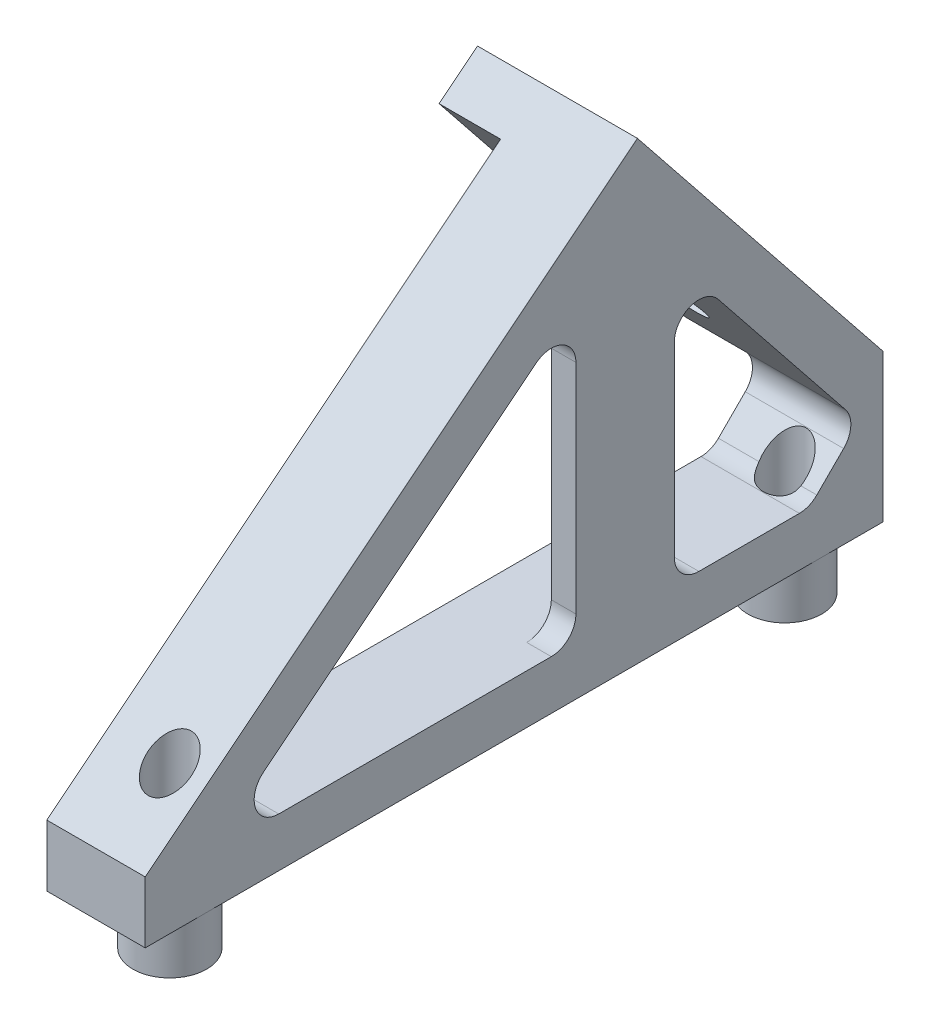
ISO-10303-21;
HEADER;
FILE_DESCRIPTION(('STEP AP214'),'2;1');
FILE_NAME('part.step','',(''),(''),'','','');
FILE_SCHEMA(('AUTOMOTIVE_DESIGN { 1 0 10303 214 1 1 1 1 }'));
ENDSEC;
DATA;
#1=APPLICATION_CONTEXT('core data for automotive mechanical design processes');
#2=APPLICATION_PROTOCOL_DEFINITION('international standard','automotive_design',2000,#1);
#3=PRODUCT_CONTEXT('',#1,'mechanical');
#4=PRODUCT('Part','Part','',(#3));
#5=PRODUCT_RELATED_PRODUCT_CATEGORY('part','',(#4));
#6=PRODUCT_DEFINITION_FORMATION('','',#4);
#7=PRODUCT_DEFINITION_CONTEXT('part definition',#1,'design');
#8=PRODUCT_DEFINITION('design','',#6,#7);
#9=PRODUCT_DEFINITION_SHAPE('','',#8);
#10=(LENGTH_UNIT() NAMED_UNIT(*) SI_UNIT(.MILLI.,.METRE.));
#11=(NAMED_UNIT(*) PLANE_ANGLE_UNIT() SI_UNIT($,.RADIAN.));
#12=(NAMED_UNIT(*) SI_UNIT($,.STERADIAN.) SOLID_ANGLE_UNIT());
#13=UNCERTAINTY_MEASURE_WITH_UNIT(LENGTH_MEASURE(1.E-05),#10,'distance_accuracy_value','');
#14=(GEOMETRIC_REPRESENTATION_CONTEXT(3) GLOBAL_UNCERTAINTY_ASSIGNED_CONTEXT((#13)) GLOBAL_UNIT_ASSIGNED_CONTEXT((#10,
#11,#12)) REPRESENTATION_CONTEXT('',''));
#15=CARTESIAN_POINT('',(0.,0.,0.));
#16=DIRECTION('',(0.,0.,1.));
#17=DIRECTION('',(1.,0.,0.));
#18=AXIS2_PLACEMENT_3D('',#15,#16,#17);
#19=CARTESIAN_POINT('',(13.,0.,0.));
#20=DIRECTION('',(0.,1.,0.));
#21=DIRECTION('',(0.,0.,1.));
#22=AXIS2_PLACEMENT_3D('',#19,#20,#21);
#23=PLANE('',#22);
#24=DIRECTION('',(0.,0.,-1.));
#25=VECTOR('',#24,1.);
#26=CARTESIAN_POINT('',(13.,0.,0.));
#27=LINE('',#26,#25);
#28=CARTESIAN_POINT('',(13.,0.,5.));
#29=VERTEX_POINT('',#28);
#30=CARTESIAN_POINT('',(13.,0.,0.));
#31=VERTEX_POINT('',#30);
#32=EDGE_CURVE('E333',#29,#31,#27,.T.);
#33=ORIENTED_EDGE('',*,*,#32,.F.);
#34=CARTESIAN_POINT('',(10.,0.,5.));
#35=DIRECTION('',(0.,-1.,0.));
#36=DIRECTION('',(0.,0.,-1.));
#37=AXIS2_PLACEMENT_3D('',#34,#35,#36);
#38=CIRCLE('',#37,3.);
#39=EDGE_CURVE('E520',#29,#29,#38,.T.);
#40=ORIENTED_EDGE('',*,*,#39,.F.);
#41=CARTESIAN_POINT('',(13.,0.,55.));
#42=VERTEX_POINT('',#41);
#43=EDGE_CURVE('E337',#42,#29,#27,.T.);
#44=ORIENTED_EDGE('',*,*,#43,.F.);
#45=CARTESIAN_POINT('',(10.,0.,55.));
#46=DIRECTION('',(0.,-1.,0.));
#47=DIRECTION('',(0.,0.,-1.));
#48=AXIS2_PLACEMENT_3D('',#45,#46,#47);
#49=CIRCLE('',#48,3.);
#50=EDGE_CURVE('E527',#42,#42,#49,.T.);
#51=ORIENTED_EDGE('',*,*,#50,.F.);
#52=CARTESIAN_POINT('',(13.,0.,60.));
#53=VERTEX_POINT('',#52);
#54=EDGE_CURVE('E334',#53,#42,#27,.T.);
#55=ORIENTED_EDGE('',*,*,#54,.F.);
#56=DIRECTION('',(-1.,0.,0.));
#57=VECTOR('',#56,1.);
#58=CARTESIAN_POINT('',(13.,0.,60.));
#59=LINE('',#58,#57);
#60=CARTESIAN_POINT('',(5.,0.,60.));
#61=VERTEX_POINT('',#60);
#62=EDGE_CURVE('E343',#53,#61,#59,.T.);
#63=ORIENTED_EDGE('',*,*,#62,.T.);
#64=DIRECTION('',(0.,0.,-1.));
#65=VECTOR('',#64,1.);
#66=CARTESIAN_POINT('',(5.,0.,0.));
#67=LINE('',#66,#65);
#68=CARTESIAN_POINT('',(5.,0.,0.));
#69=VERTEX_POINT('',#68);
#70=EDGE_CURVE('E358',#61,#69,#67,.T.);
#71=ORIENTED_EDGE('',*,*,#70,.T.);
#72=DIRECTION('',(-1.,0.,0.));
#73=VECTOR('',#72,1.);
#74=CARTESIAN_POINT('',(13.,0.,0.));
#75=LINE('',#74,#73);
#76=EDGE_CURVE('E336',#31,#69,#75,.T.);
#77=ORIENTED_EDGE('',*,*,#76,.F.);
#78=EDGE_LOOP('',(#33,#40,#44,#51,#55,#63,#71,#77));
#79=FACE_BOUND('',#78,.T.);
#80=ADVANCED_FACE('F32',(#79),#23,.F.);
#81=CARTESIAN_POINT('',(0.,27.8751456380356,24.9826212271511));
#82=DIRECTION('',(0.,0.,-1.));
#83=DIRECTION('',(0.,1.,0.));
#84=AXIS2_PLACEMENT_3D('',#81,#82,#83);
#85=PLANE('',#84);
#86=DIRECTION('',(0.,1.,0.));
#87=VECTOR('',#86,1.);
#88=CARTESIAN_POINT('',(11.,27.8751456380356,24.9826212271511));
#89=LINE('',#88,#87);
#90=CARTESIAN_POINT('',(11.,6.,24.9826212271511));
#91=VERTEX_POINT('',#90);
#92=CARTESIAN_POINT('',(11.,23.7155203644786,24.9826212271511));
#93=VERTEX_POINT('',#92);
#94=EDGE_CURVE('E397',#91,#93,#89,.T.);
#95=ORIENTED_EDGE('',*,*,#94,.F.);
#96=DIRECTION('',(1.,0.,0.));
#97=VECTOR('',#96,1.);
#98=CARTESIAN_POINT('',(13.,6.,24.9826212271511));
#99=LINE('',#98,#97);
#100=CARTESIAN_POINT('',(13.,6.,24.9826212271511));
#101=VERTEX_POINT('',#100);
#102=EDGE_CURVE('E236',#91,#101,#99,.T.);
#103=ORIENTED_EDGE('',*,*,#102,.T.);
#104=DIRECTION('',(0.,1.,0.));
#105=VECTOR('',#104,1.);
#106=CARTESIAN_POINT('',(13.,27.8751456380356,24.9826212271511));
#107=LINE('',#106,#105);
#108=CARTESIAN_POINT('',(13.,23.7155203644786,24.9826212271511));
#109=VERTEX_POINT('',#108);
#110=EDGE_CURVE('E307',#101,#109,#107,.T.);
#111=ORIENTED_EDGE('',*,*,#110,.T.);
#112=DIRECTION('',(1.,0.,0.));
#113=VECTOR('',#112,1.);
#114=CARTESIAN_POINT('',(5.,23.7155203644786,24.9826212271511));
#115=LINE('',#114,#113);
#116=EDGE_CURVE('E233',#109,#93,#115,.F.);
#117=ORIENTED_EDGE('',*,*,#116,.T.);
#118=EDGE_LOOP('',(#95,#103,#111,#117));
#119=FACE_BOUND('',#118,.T.);
#120=ADVANCED_FACE('F441',(#119),#85,.F.);
#121=CARTESIAN_POINT('',(0.,3.99999999999999,16.9826212271511));
#122=DIRECTION('',(0.,0.,1.));
#123=DIRECTION('',(1.,0.,0.));
#124=AXIS2_PLACEMENT_3D('',#121,#122,#123);
#125=PLANE('',#124);
#126=DIRECTION('',(0.,-1.,0.));
#127=VECTOR('',#126,1.);
#128=CARTESIAN_POINT('',(11.,3.99999999999999,16.9826212271511));
#129=LINE('',#128,#127);
#130=CARTESIAN_POINT('',(11.,21.131638846144,16.9826212271511));
#131=VERTEX_POINT('',#130);
#132=CARTESIAN_POINT('',(11.,5.99999999999999,16.9826212271511));
#133=VERTEX_POINT('',#132);
#134=EDGE_CURVE('E270',#131,#133,#129,.T.);
#135=ORIENTED_EDGE('',*,*,#134,.F.);
#136=DIRECTION('',(1.,0.,0.));
#137=VECTOR('',#136,1.);
#138=CARTESIAN_POINT('',(13.,21.131638846144,16.9826212271511));
#139=LINE('',#138,#137);
#140=CARTESIAN_POINT('',(13.,21.131638846144,16.9826212271511));
#141=VERTEX_POINT('',#140);
#142=EDGE_CURVE('E371',#131,#141,#139,.T.);
#143=ORIENTED_EDGE('',*,*,#142,.T.);
#144=DIRECTION('',(0.,-1.,0.));
#145=VECTOR('',#144,1.);
#146=CARTESIAN_POINT('',(13.,3.99999999999999,16.9826212271511));
#147=LINE('',#146,#145);
#148=CARTESIAN_POINT('',(13.,5.99999999999999,16.9826212271511));
#149=VERTEX_POINT('',#148);
#150=EDGE_CURVE('E287',#141,#149,#147,.T.);
#151=ORIENTED_EDGE('',*,*,#150,.T.);
#152=DIRECTION('',(1.,0.,0.));
#153=VECTOR('',#152,1.);
#154=CARTESIAN_POINT('',(5.,5.99999999999999,16.9826212271511));
#155=LINE('',#154,#153);
#156=EDGE_CURVE('E216',#149,#133,#155,.F.);
#157=ORIENTED_EDGE('',*,*,#156,.T.);
#158=EDGE_LOOP('',(#135,#143,#151,#157));
#159=FACE_BOUND('',#158,.T.);
#160=ADVANCED_FACE('F376',(#159),#125,.F.);
#161=CARTESIAN_POINT('',(0.,5.99999999999999,14.9826212271511));
#162=DIRECTION('',(-1.,0.,0.));
#163=DIRECTION('',(0.,0.,1.));
#164=AXIS2_PLACEMENT_3D('',#161,#162,#163);
#165=CYLINDRICAL_SURFACE('',#164,2.);
#166=CARTESIAN_POINT('',(11.,5.99999999999999,14.9826212271511));
#167=DIRECTION('',(-1.,0.,0.));
#168=DIRECTION('',(0.,0.,1.));
#169=AXIS2_PLACEMENT_3D('',#166,#167,#168);
#170=CIRCLE('',#169,2.);
#171=CARTESIAN_POINT('',(11.,3.99999999999999,14.9826212271511));
#172=VERTEX_POINT('',#171);
#173=EDGE_CURVE('E266',#133,#172,#170,.F.);
#174=ORIENTED_EDGE('',*,*,#173,.F.);
#175=ORIENTED_EDGE('',*,*,#156,.F.);
#176=CARTESIAN_POINT('',(13.,5.99999999999999,14.9826212271511));
#177=DIRECTION('',(-1.,0.,0.));
#178=DIRECTION('',(0.,0.,1.));
#179=AXIS2_PLACEMENT_3D('',#176,#177,#178);
#180=CIRCLE('',#179,2.);
#181=CARTESIAN_POINT('',(13.,3.99999999999999,14.9826212271511));
#182=VERTEX_POINT('',#181);
#183=EDGE_CURVE('E238',#182,#149,#180,.T.);
#184=ORIENTED_EDGE('',*,*,#183,.F.);
#185=DIRECTION('',(1.,0.,0.));
#186=VECTOR('',#185,1.);
#187=CARTESIAN_POINT('',(13.,3.99999999999999,14.9826212271511));
#188=LINE('',#187,#186);
#189=EDGE_CURVE('E369',#172,#182,#188,.T.);
#190=ORIENTED_EDGE('',*,*,#189,.F.);
#191=EDGE_LOOP('',(#174,#175,#184,#190));
#192=FACE_BOUND('',#191,.T.);
#193=ADVANCED_FACE('F382',(#192),#165,.F.);
#194=CARTESIAN_POINT('',(0.,21.131638846144,14.9826212271511));
#195=DIRECTION('',(-1.,0.,0.));
#196=DIRECTION('',(0.,0.,1.));
#197=AXIS2_PLACEMENT_3D('',#194,#195,#196);
#198=CYLINDRICAL_SURFACE('',#197,2.);
#199=CARTESIAN_POINT('',(11.,21.131638846144,14.9826212271511));
#200=DIRECTION('',(-1.,0.,0.));
#201=DIRECTION('',(0.,0.,1.));
#202=AXIS2_PLACEMENT_3D('',#199,#200,#201);
#203=CIRCLE('',#202,2.);
#204=CARTESIAN_POINT('',(11.,22.380552672841,13.4205027126058));
#205=VERTEX_POINT('',#204);
#206=EDGE_CURVE('E406',#205,#131,#203,.F.);
#207=ORIENTED_EDGE('',*,*,#206,.F.);
#208=DIRECTION('',(1.,0.,0.));
#209=VECTOR('',#208,1.);
#210=CARTESIAN_POINT('',(5.,22.380552672841,13.4205027126058));
#211=LINE('',#210,#209);
#212=CARTESIAN_POINT('',(13.,22.3805526728409,13.4205027126059));
#213=VERTEX_POINT('',#212);
#214=EDGE_CURVE('E215',#213,#205,#211,.F.);
#215=ORIENTED_EDGE('',*,*,#214,.F.);
#216=CARTESIAN_POINT('',(13.,21.131638846144,14.9826212271511));
#217=DIRECTION('',(-1.,0.,0.));
#218=DIRECTION('',(0.,0.,1.));
#219=AXIS2_PLACEMENT_3D('',#216,#217,#218);
#220=CIRCLE('',#219,2.);
#221=EDGE_CURVE('E247',#141,#213,#220,.T.);
#222=ORIENTED_EDGE('',*,*,#221,.F.);
#223=ORIENTED_EDGE('',*,*,#142,.F.);
#224=EDGE_LOOP('',(#207,#215,#222,#223));
#225=FACE_BOUND('',#224,.T.);
#226=ADVANCED_FACE('F411',(#225),#198,.F.);
#227=CARTESIAN_POINT('',(0.,5.99999999999999,26.9826212271511));
#228=DIRECTION('',(-1.,0.,0.));
#229=DIRECTION('',(0.,0.,1.));
#230=AXIS2_PLACEMENT_3D('',#227,#228,#229);
#231=CYLINDRICAL_SURFACE('',#230,2.);
#232=CARTESIAN_POINT('',(11.,5.99999999999999,26.9826212271511));
#233=DIRECTION('',(-1.,0.,0.));
#234=DIRECTION('',(0.,0.,1.));
#235=AXIS2_PLACEMENT_3D('',#232,#233,#234);
#236=CIRCLE('',#235,2.);
#237=CARTESIAN_POINT('',(11.,3.99999999999999,26.9826212271511));
#238=VERTEX_POINT('',#237);
#239=EDGE_CURVE('E404',#238,#91,#236,.F.);
#240=ORIENTED_EDGE('',*,*,#239,.F.);
#241=DIRECTION('',(1.,0.,0.));
#242=VECTOR('',#241,1.);
#243=CARTESIAN_POINT('',(5.,3.99999999999999,26.9826212271511));
#244=LINE('',#243,#242);
#245=CARTESIAN_POINT('',(13.,3.99999999999999,26.9826212271511));
#246=VERTEX_POINT('',#245);
#247=EDGE_CURVE('E224',#246,#238,#244,.F.);
#248=ORIENTED_EDGE('',*,*,#247,.F.);
#249=CARTESIAN_POINT('',(13.,5.99999999999999,26.9826212271511));
#250=DIRECTION('',(-1.,0.,0.));
#251=DIRECTION('',(0.,0.,1.));
#252=AXIS2_PLACEMENT_3D('',#249,#250,#251);
#253=CIRCLE('',#252,2.);
#254=EDGE_CURVE('E254',#101,#246,#253,.T.);
#255=ORIENTED_EDGE('',*,*,#254,.F.);
#256=ORIENTED_EDGE('',*,*,#102,.F.);
#257=EDGE_LOOP('',(#240,#248,#255,#256));
#258=FACE_BOUND('',#257,.T.);
#259=ADVANCED_FACE('F475',(#258),#231,.F.);
#260=CARTESIAN_POINT('',(0.,23.7155203644786,26.9826212271511));
#261=DIRECTION('',(-1.,0.,0.));
#262=DIRECTION('',(0.,0.,1.));
#263=AXIS2_PLACEMENT_3D('',#260,#261,#262);
#264=CYLINDRICAL_SURFACE('',#263,2.);
#265=CARTESIAN_POINT('',(11.,23.7155203644786,26.9826212271511));
#266=DIRECTION('',(-1.,0.,0.));
#267=DIRECTION('',(0.,0.,1.));
#268=AXIS2_PLACEMENT_3D('',#265,#266,#267);
#269=CIRCLE('',#268,2.);
#270=CARTESIAN_POINT('',(11.,25.2776388790238,28.2315350538481));
#271=VERTEX_POINT('',#270);
#272=EDGE_CURVE('E11',#93,#271,#269,.F.);
#273=ORIENTED_EDGE('',*,*,#272,.F.);
#274=ORIENTED_EDGE('',*,*,#116,.F.);
#275=CARTESIAN_POINT('',(13.,23.7155203644786,26.9826212271511));
#276=DIRECTION('',(-1.,0.,0.));
#277=DIRECTION('',(0.,0.,1.));
#278=AXIS2_PLACEMENT_3D('',#275,#276,#277);
#279=CIRCLE('',#278,2.);
#280=CARTESIAN_POINT('',(13.,25.2776388790239,28.2315350538481));
#281=VERTEX_POINT('',#280);
#282=EDGE_CURVE('E40',#281,#109,#279,.T.);
#283=ORIENTED_EDGE('',*,*,#282,.F.);
#284=DIRECTION('',(1.,0.,0.));
#285=VECTOR('',#284,1.);
#286=CARTESIAN_POINT('',(13.,25.2776388790239,28.2315350538481));
#287=LINE('',#286,#285);
#288=EDGE_CURVE('E229',#271,#281,#287,.T.);
#289=ORIENTED_EDGE('',*,*,#288,.F.);
#290=EDGE_LOOP('',(#273,#274,#283,#289));
#291=FACE_BOUND('',#290,.T.);
#292=ADVANCED_FACE('F34',(#291),#264,.F.);
#293=CARTESIAN_POINT('',(13.,12.,0.));
#294=DIRECTION('',(0.,0.,1.));
#295=DIRECTION('',(0.,-1.,0.));
#296=AXIS2_PLACEMENT_3D('',#293,#294,#295);
#297=PLANE('',#296);
#298=DIRECTION('',(0.,1.,0.));
#299=VECTOR('',#298,1.);
#300=CARTESIAN_POINT('',(5.,12.,0.));
#301=LINE('',#300,#299);
#302=CARTESIAN_POINT('',(5.,12.,0.));
#303=VERTEX_POINT('',#302);
#304=EDGE_CURVE('E320',#69,#303,#301,.T.);
#305=ORIENTED_EDGE('',*,*,#304,.T.);
#306=DIRECTION('',(-1.,0.,0.));
#307=VECTOR('',#306,1.);
#308=CARTESIAN_POINT('',(13.,12.,0.));
#309=LINE('',#308,#307);
#310=CARTESIAN_POINT('',(13.,12.,0.));
#311=VERTEX_POINT('',#310);
#312=EDGE_CURVE('E352',#311,#303,#309,.T.);
#313=ORIENTED_EDGE('',*,*,#312,.F.);
#314=DIRECTION('',(0.,1.,0.));
#315=VECTOR('',#314,1.);
#316=CARTESIAN_POINT('',(13.,12.,0.));
#317=LINE('',#316,#315);
#318=EDGE_CURVE('E323',#31,#311,#317,.T.);
#319=ORIENTED_EDGE('',*,*,#318,.F.);
#320=ORIENTED_EDGE('',*,*,#76,.T.);
#321=EDGE_LOOP('',(#305,#313,#319,#320));
#322=FACE_BOUND('',#321,.T.);
#323=ADVANCED_FACE('F465',(#322),#297,.F.);
#324=CARTESIAN_POINT('',(13.,36.9938962327247,19.9826212271511));
#325=DIRECTION('',(0.,-0.624456913348472,0.781059257272647));
#326=DIRECTION('',(0.,-0.781059257272647,-0.624456913348472));
#327=AXIS2_PLACEMENT_3D('',#324,#325,#326);
#328=PLANE('',#327);
#329=CARTESIAN_POINT('',(4.,17.4674148009085,4.37119839343931));
#330=DIRECTION('',(0.,0.624456913348472,-0.781059257272647));
#331=DIRECTION('',(0.,0.781059257272647,0.624456913348472));
#332=AXIS2_PLACEMENT_3D('',#329,#330,#331);
#333=CIRCLE('',#332,2.);
#334=CARTESIAN_POINT('',(4.,19.0295333154538,5.62011222013625));
#335=VERTEX_POINT('',#334);
#336=EDGE_CURVE('E259',#335,#335,#333,.T.);
#337=ORIENTED_EDGE('',*,*,#336,.F.);
#338=EDGE_LOOP('',(#337));
#339=FACE_BOUND('',#338,.T.);
#340=CARTESIAN_POINT('',(4.,31.5264814318162,15.6114228337118));
#341=DIRECTION('',(0.,0.624456913348472,-0.781059257272647));
#342=DIRECTION('',(0.,0.781059257272647,0.624456913348472));
#343=AXIS2_PLACEMENT_3D('',#340,#341,#342);
#344=CIRCLE('',#343,2.);
#345=CARTESIAN_POINT('',(4.,33.0885999463615,16.8603366604088));
#346=VERTEX_POINT('',#345);
#347=EDGE_CURVE('E258',#346,#346,#344,.T.);
#348=ORIENTED_EDGE('',*,*,#347,.F.);
#349=EDGE_LOOP('',(#348));
#350=FACE_BOUND('',#349,.T.);
#351=DIRECTION('',(0.,0.781059257272647,0.624456913348473));
#352=VECTOR('',#351,1.);
#353=CARTESIAN_POINT('',(0.,36.9938962327247,19.9826212271511));
#354=LINE('',#353,#352);
#355=CARTESIAN_POINT('',(0.,12.,0.));
#356=VERTEX_POINT('',#355);
#357=CARTESIAN_POINT('',(0.,36.9938962327247,19.9826212271511));
#358=VERTEX_POINT('',#357);
#359=EDGE_CURVE('E322',#356,#358,#354,.T.);
#360=ORIENTED_EDGE('',*,*,#359,.T.);
#361=DIRECTION('',(-1.,0.,0.));
#362=VECTOR('',#361,1.);
#363=CARTESIAN_POINT('',(13.,36.9938962327247,19.9826212271511));
#364=LINE('',#363,#362);
#365=CARTESIAN_POINT('',(13.,36.9938962327247,19.9826212271511));
#366=VERTEX_POINT('',#365);
#367=EDGE_CURVE('E349',#366,#358,#364,.T.);
#368=ORIENTED_EDGE('',*,*,#367,.F.);
#369=DIRECTION('',(0.,0.781059257272647,0.624456913348473));
#370=VECTOR('',#369,1.);
#371=CARTESIAN_POINT('',(13.,36.9938962327247,19.9826212271511));
#372=LINE('',#371,#370);
#373=EDGE_CURVE('E326',#311,#366,#372,.T.);
#374=ORIENTED_EDGE('',*,*,#373,.F.);
#375=ORIENTED_EDGE('',*,*,#312,.T.);
#376=DIRECTION('',(-1.,0.,0.));
#377=VECTOR('',#376,1.);
#378=CARTESIAN_POINT('',(13.,12.,0.));
#379=LINE('',#378,#377);
#380=EDGE_CURVE('E283',#303,#356,#379,.T.);
#381=ORIENTED_EDGE('',*,*,#380,.T.);
#382=EDGE_LOOP('',(#360,#368,#374,#375,#381));
#383=FACE_BOUND('',#382,.T.);
#384=ADVANCED_FACE('F461',(#339,#350,#383),#328,.F.);
#385=CARTESIAN_POINT('',(13.,4.99999999999999,60.));
#386=DIRECTION('',(0.,-0.781059257272644,-0.624456913348475));
#387=DIRECTION('',(0.,0.624456913348475,-0.781059257272644));
#388=AXIS2_PLACEMENT_3D('',#385,#386,#387);
#389=PLANE('',#388);
#390=CARTESIAN_POINT('',(10.,8.99750023787564,55.));
#391=DIRECTION('',(0.,-0.781059257272644,-0.624456913348475));
#392=DIRECTION('',(0.,-0.624456913348475,0.781059257272644));
#393=AXIS2_PLACEMENT_3D('',#390,#391,#392);
#394=ELLIPSE('',#393,2.2405470311059,1.75);
#395=CARTESIAN_POINT('',(10.,7.59837515461916,56.75));
#396=VERTEX_POINT('',#395);
#397=EDGE_CURVE('E524',#396,#396,#394,.F.);
#398=ORIENTED_EDGE('',*,*,#397,.F.);
#399=EDGE_LOOP('',(#398));
#400=FACE_BOUND('',#399,.T.);
#401=DIRECTION('',(0.,-0.624456913348475,0.781059257272644));
#402=VECTOR('',#401,1.);
#403=CARTESIAN_POINT('',(0.,4.99999999999999,60.));
#404=LINE('',#403,#402);
#405=CARTESIAN_POINT('',(0.,34.4960685793308,23.1068582562417));
#406=VERTEX_POINT('',#405);
#407=EDGE_CURVE('E327',#358,#406,#404,.T.);
#408=ORIENTED_EDGE('',*,*,#407,.T.);
#409=DIRECTION('',(-1.,0.,0.));
#410=VECTOR('',#409,1.);
#411=CARTESIAN_POINT('',(0.,34.4960685793308,23.1068582562417));
#412=LINE('',#411,#410);
#413=CARTESIAN_POINT('',(5.,34.4960685793308,23.1068582562417));
#414=VERTEX_POINT('',#413);
#415=EDGE_CURVE('E313',#414,#406,#412,.T.);
#416=ORIENTED_EDGE('',*,*,#415,.F.);
#417=DIRECTION('',(0.,0.624456913348475,-0.781059257272644));
#418=VECTOR('',#417,1.);
#419=CARTESIAN_POINT('',(5.,34.4960685793308,23.1068582562417));
#420=LINE('',#419,#418);
#421=CARTESIAN_POINT('',(5.,5.00000000000001,60.));
#422=VERTEX_POINT('',#421);
#423=EDGE_CURVE('E310',#422,#414,#420,.T.);
#424=ORIENTED_EDGE('',*,*,#423,.F.);
#425=DIRECTION('',(-1.,0.,0.));
#426=VECTOR('',#425,1.);
#427=CARTESIAN_POINT('',(13.,4.99999999999999,60.));
#428=LINE('',#427,#426);
#429=CARTESIAN_POINT('',(13.,4.99999999999999,60.));
#430=VERTEX_POINT('',#429);
#431=EDGE_CURVE('E346',#430,#422,#428,.T.);
#432=ORIENTED_EDGE('',*,*,#431,.F.);
#433=DIRECTION('',(0.,-0.624456913348475,0.781059257272644));
#434=VECTOR('',#433,1.);
#435=CARTESIAN_POINT('',(13.,4.99999999999999,60.));
#436=LINE('',#435,#434);
#437=EDGE_CURVE('E329',#366,#430,#436,.T.);
#438=ORIENTED_EDGE('',*,*,#437,.F.);
#439=ORIENTED_EDGE('',*,*,#367,.T.);
#440=EDGE_LOOP('',(#408,#416,#424,#432,#438,#439));
#441=FACE_BOUND('',#440,.T.);
#442=ADVANCED_FACE('F457',(#400,#441),#389,.F.);
#443=CARTESIAN_POINT('',(13.,0.,60.));
#444=DIRECTION('',(0.,0.,-1.));
#445=DIRECTION('',(-1.,0.,0.));
#446=AXIS2_PLACEMENT_3D('',#443,#444,#445);
#447=PLANE('',#446);
#448=ORIENTED_EDGE('',*,*,#431,.T.);
#449=DIRECTION('',(0.,-1.,0.));
#450=VECTOR('',#449,1.);
#451=CARTESIAN_POINT('',(5.,0.,60.));
#452=LINE('',#451,#450);
#453=EDGE_CURVE('E317',#422,#61,#452,.T.);
#454=ORIENTED_EDGE('',*,*,#453,.T.);
#455=ORIENTED_EDGE('',*,*,#62,.F.);
#456=DIRECTION('',(0.,-1.,0.));
#457=VECTOR('',#456,1.);
#458=CARTESIAN_POINT('',(13.,0.,60.));
#459=LINE('',#458,#457);
#460=EDGE_CURVE('E331',#430,#53,#459,.T.);
#461=ORIENTED_EDGE('',*,*,#460,.F.);
#462=EDGE_LOOP('',(#448,#454,#455,#461));
#463=FACE_BOUND('',#462,.T.);
#464=ADVANCED_FACE('F454',(#463),#447,.F.);
#465=CARTESIAN_POINT('',(13.,0.,0.));
#466=DIRECTION('',(-1.,0.,0.));
#467=DIRECTION('',(0.,0.,1.));
#468=AXIS2_PLACEMENT_3D('',#465,#466,#467);
#469=PLANE('',#468);
#470=DIRECTION('',(0.,0.,-1.));
#471=VECTOR('',#470,1.);
#472=CARTESIAN_POINT('',(13.,4.,5.98262122715113));
#473=LINE('',#472,#471);
#474=CARTESIAN_POINT('',(13.,4.,6.81104835189732));
#475=VERTEX_POINT('',#474);
#476=EDGE_CURVE('E290',#182,#475,#473,.T.);
#477=ORIENTED_EDGE('',*,*,#476,.F.);
#478=ORIENTED_EDGE('',*,*,#183,.T.);
#479=ORIENTED_EDGE('',*,*,#150,.F.);
#480=ORIENTED_EDGE('',*,*,#221,.T.);
#481=DIRECTION('',(0.,0.781059257272647,0.624456913348473));
#482=VECTOR('',#481,1.);
#483=CARTESIAN_POINT('',(13.,26.83598519639,16.9826212271511));
#484=LINE('',#483,#482);
#485=CARTESIAN_POINT('',(13.,9.4307271072348,3.0671165568142));
#486=VERTEX_POINT('',#485);
#487=EDGE_CURVE('E295',#486,#213,#484,.T.);
#488=ORIENTED_EDGE('',*,*,#487,.F.);
#489=CARTESIAN_POINT('',(13.,8.18181328053791,4.62923507135941));
#490=DIRECTION('',(-1.,0.,0.));
#491=DIRECTION('',(0.,0.,1.));
#492=AXIS2_PLACEMENT_3D('',#489,#490,#491);
#493=CIRCLE('',#492,2.);
#494=CARTESIAN_POINT('',(13.,6.76759971816483,3.21502150898631));
#495=VERTEX_POINT('',#494);
#496=EDGE_CURVE('E243',#486,#495,#493,.T.);
#497=ORIENTED_EDGE('',*,*,#496,.T.);
#498=DIRECTION('',(0.,0.707106781186549,-0.707106781186546));
#499=VECTOR('',#498,1.);
#500=CARTESIAN_POINT('',(13.,8.03299308645098,1.94962814070017));
#501=LINE('',#500,#499);
#502=CARTESIAN_POINT('',(13.,4.58578643762691,5.39683478952422));
#503=VERTEX_POINT('',#502);
#504=EDGE_CURVE('E293',#503,#495,#501,.T.);
#505=ORIENTED_EDGE('',*,*,#504,.F.);
#506=CARTESIAN_POINT('',(13.,6.,6.81104835189732));
#507=DIRECTION('',(-1.,0.,0.));
#508=DIRECTION('',(0.,0.,1.));
#509=AXIS2_PLACEMENT_3D('',#506,#507,#508);
#510=CIRCLE('',#509,2.);
#511=EDGE_CURVE('E211',#503,#475,#510,.T.);
#512=ORIENTED_EDGE('',*,*,#511,.T.);
#513=EDGE_LOOP('',(#477,#478,#479,#480,#488,#497,#505,#512));
#514=FACE_BOUND('',#513,.T.);
#515=DIRECTION('',(0.,0.,-1.));
#516=VECTOR('',#515,1.);
#517=CARTESIAN_POINT('',(13.,3.99999999999999,24.9826212271511));
#518=LINE('',#517,#516);
#519=CARTESIAN_POINT('',(13.,3.99999999999999,49.1408692700492));
#520=VERTEX_POINT('',#519);
#521=EDGE_CURVE('E304',#520,#246,#518,.T.);
#522=ORIENTED_EDGE('',*,*,#521,.F.);
#523=CARTESIAN_POINT('',(13.,5.99999999999999,49.1408692700492));
#524=DIRECTION('',(-1.,0.,0.));
#525=DIRECTION('',(0.,0.,1.));
#526=AXIS2_PLACEMENT_3D('',#523,#524,#525);
#527=CIRCLE('',#526,2.);
#528=CARTESIAN_POINT('',(13.,7.56211851454528,50.3897830967462));
#529=VERTEX_POINT('',#528);
#530=EDGE_CURVE('E249',#520,#529,#527,.T.);
#531=ORIENTED_EDGE('',*,*,#530,.T.);
#532=DIRECTION('',(0.,-0.624456913348476,0.781059257272644));
#533=VECTOR('',#532,1.);
#534=CARTESIAN_POINT('',(13.,3.99999999999999,54.8452156202953));
#535=LINE('',#534,#533);
#536=EDGE_CURVE('E301',#281,#529,#535,.T.);
#537=ORIENTED_EDGE('',*,*,#536,.F.);
#538=ORIENTED_EDGE('',*,*,#282,.T.);
#539=ORIENTED_EDGE('',*,*,#110,.F.);
#540=ORIENTED_EDGE('',*,*,#254,.T.);
#541=EDGE_LOOP('',(#522,#531,#537,#538,#539,#540));
#542=FACE_BOUND('',#541,.T.);
#543=ORIENTED_EDGE('',*,*,#318,.T.);
#544=ORIENTED_EDGE('',*,*,#373,.T.);
#545=ORIENTED_EDGE('',*,*,#437,.T.);
#546=ORIENTED_EDGE('',*,*,#460,.T.);
#547=ORIENTED_EDGE('',*,*,#54,.T.);
#548=ORIENTED_EDGE('',*,*,#43,.T.);
#549=ORIENTED_EDGE('',*,*,#32,.T.);
#550=EDGE_LOOP('',(#543,#544,#545,#546,#547,#548,#549));
#551=FACE_BOUND('',#550,.T.);
#552=ADVANCED_FACE('F420',(#514,#542,#551),#469,.F.);
#553=CARTESIAN_POINT('',(0.,0.,0.));
#554=DIRECTION('',(-1.,0.,0.));
#555=DIRECTION('',(0.,0.,1.));
#556=AXIS2_PLACEMENT_3D('',#553,#554,#555);
#557=PLANE('',#556);
#558=DIRECTION('',(0.,-0.624456913348475,0.781059257272644));
#559=VECTOR('',#558,1.);
#560=CARTESIAN_POINT('',(0.,17.6201122201363,-7.02953331545388));
#561=LINE('',#560,#559);
#562=CARTESIAN_POINT('',(0.,9.50217234660617,3.12423702909049));
#563=VERTEX_POINT('',#562);
#564=EDGE_CURVE('E280',#356,#563,#561,.T.);
#565=ORIENTED_EDGE('',*,*,#564,.T.);
#566=DIRECTION('',(0.,-0.781059257272645,-0.624456913348475));
#567=VECTOR('',#566,1.);
#568=CARTESIAN_POINT('',(0.,2.18152958615063,-2.72861720617424));
#569=LINE('',#568,#567);
#570=EDGE_CURVE('E355',#406,#563,#569,.T.);
#571=ORIENTED_EDGE('',*,*,#570,.F.);
#572=ORIENTED_EDGE('',*,*,#407,.F.);
#573=ORIENTED_EDGE('',*,*,#359,.F.);
#574=EDGE_LOOP('',(#565,#571,#572,#573));
#575=FACE_BOUND('',#574,.T.);
#576=ADVANCED_FACE('F452',(#575),#557,.T.);
#577=CARTESIAN_POINT('',(5.,2.18152958615062,-2.72861720617425));
#578=DIRECTION('',(1.,0.,0.));
#579=DIRECTION('',(0.,0.,-1.));
#580=AXIS2_PLACEMENT_3D('',#577,#578,#579);
#581=PLANE('',#580);
#582=CARTESIAN_POINT('',(5.,5.99999999999999,49.1408692700492));
#583=DIRECTION('',(1.,0.,0.));
#584=DIRECTION('',(0.,0.,-1.));
#585=AXIS2_PLACEMENT_3D('',#582,#583,#584);
#586=CIRCLE('',#585,2.);
#587=CARTESIAN_POINT('',(5.,7.56211851454527,50.3897830967462));
#588=VERTEX_POINT('',#587);
#589=CARTESIAN_POINT('',(5.,3.99999999999999,49.1408692700492));
#590=VERTEX_POINT('',#589);
#591=EDGE_CURVE('E251',#588,#590,#586,.T.);
#592=ORIENTED_EDGE('',*,*,#591,.T.);
#593=DIRECTION('',(0.,0.,-1.));
#594=VECTOR('',#593,1.);
#595=CARTESIAN_POINT('',(5.,4.,-2.72861720617425));
#596=LINE('',#595,#594);
#597=CARTESIAN_POINT('',(5.,4.,6.81104835189732));
#598=VERTEX_POINT('',#597);
#599=EDGE_CURVE('E364',#590,#598,#596,.T.);
#600=ORIENTED_EDGE('',*,*,#599,.T.);
#601=CARTESIAN_POINT('',(5.,6.,6.81104835189732));
#602=DIRECTION('',(1.,0.,0.));
#603=DIRECTION('',(0.,0.,-1.));
#604=AXIS2_PLACEMENT_3D('',#601,#602,#603);
#605=CIRCLE('',#604,2.);
#606=CARTESIAN_POINT('',(5.,4.5857864376269,5.39683478952422));
#607=VERTEX_POINT('',#606);
#608=EDGE_CURVE('E241',#598,#607,#605,.T.);
#609=ORIENTED_EDGE('',*,*,#608,.T.);
#610=DIRECTION('',(0.,0.707106781186549,-0.707106781186546));
#611=VECTOR('',#610,1.);
#612=CARTESIAN_POINT('',(5.,7.44638400973799,2.53623721741315));
#613=LINE('',#612,#611);
#614=CARTESIAN_POINT('',(5.,6.76759971816482,3.21502150898631));
#615=VERTEX_POINT('',#614);
#616=EDGE_CURVE('E298',#607,#615,#613,.T.);
#617=ORIENTED_EDGE('',*,*,#616,.T.);
#618=CARTESIAN_POINT('',(5.,8.18181328053791,4.62923507135941));
#619=DIRECTION('',(1.,0.,0.));
#620=DIRECTION('',(0.,0.,-1.));
#621=AXIS2_PLACEMENT_3D('',#618,#619,#620);
#622=CIRCLE('',#621,2.);
#623=CARTESIAN_POINT('',(5.,9.43072710723487,3.06711655681412));
#624=VERTEX_POINT('',#623);
#625=EDGE_CURVE('E245',#615,#624,#622,.T.);
#626=ORIENTED_EDGE('',*,*,#625,.T.);
#627=DIRECTION('',(0.,0.781059257272644,0.624456913348475));
#628=VECTOR('',#627,1.);
#629=CARTESIAN_POINT('',(5.,9.50217234660617,3.12423702909049));
#630=LINE('',#629,#628);
#631=CARTESIAN_POINT('',(5.,9.50217234660617,3.12423702909049));
#632=VERTEX_POINT('',#631);
#633=EDGE_CURVE('E54',#624,#632,#630,.T.);
#634=ORIENTED_EDGE('',*,*,#633,.T.);
#635=DIRECTION('',(0.,-0.624456913348475,0.781059257272644));
#636=VECTOR('',#635,1.);
#637=CARTESIAN_POINT('',(5.,17.6201122201363,-7.02953331545388));
#638=LINE('',#637,#636);
#639=EDGE_CURVE('E279',#303,#632,#638,.T.);
#640=ORIENTED_EDGE('',*,*,#639,.F.);
#641=ORIENTED_EDGE('',*,*,#304,.F.);
#642=ORIENTED_EDGE('',*,*,#70,.F.);
#643=ORIENTED_EDGE('',*,*,#453,.F.);
#644=ORIENTED_EDGE('',*,*,#423,.T.);
#645=DIRECTION('',(0.,0.781059257272644,0.624456913348475));
#646=VECTOR('',#645,1.);
#647=CARTESIAN_POINT('',(5.,2.18152958615062,-2.72861720617425));
#648=LINE('',#647,#646);
#649=CARTESIAN_POINT('',(5.,31.3718315502402,20.6090306028478));
#650=VERTEX_POINT('',#649);
#651=EDGE_CURVE('E315',#650,#414,#648,.T.);
#652=ORIENTED_EDGE('',*,*,#651,.F.);
#653=DIRECTION('',(0.,-0.624456913348476,0.781059257272644));
#654=VECTOR('',#653,1.);
#655=CARTESIAN_POINT('',(5.,31.3718315502402,20.6090306028478));
#656=LINE('',#655,#654);
#657=EDGE_CURVE('E361',#650,#588,#656,.T.);
#658=ORIENTED_EDGE('',*,*,#657,.T.);
#659=EDGE_LOOP('',(#592,#600,#609,#617,#626,#634,#640,#641,#642,#643,#644,#652,#658));
#660=FACE_BOUND('',#659,.T.);
#661=ADVANCED_FACE('F423',(#660),#581,.F.);
#662=CARTESIAN_POINT('',(0.,2.18152958615062,-2.72861720617425));
#663=DIRECTION('',(0.,0.624456913348475,-0.781059257272644));
#664=DIRECTION('',(0.,0.781059257272645,0.624456913348475));
#665=AXIS2_PLACEMENT_3D('',#662,#663,#664);
#666=PLANE('',#665);
#667=CARTESIAN_POINT('',(4.,14.9695871475147,7.49543542252983));
#668=DIRECTION('',(0.,0.624456913348475,-0.781059257272644));
#669=DIRECTION('',(0.,0.781059257272645,0.624456913348475));
#670=AXIS2_PLACEMENT_3D('',#667,#668,#669);
#671=CIRCLE('',#670,2.);
#672=CARTESIAN_POINT('',(4.,16.53170566206,8.74434924922678));
#673=VERTEX_POINT('',#672);
#674=EDGE_CURVE('E256',#673,#673,#671,.T.);
#675=ORIENTED_EDGE('',*,*,#674,.T.);
#676=EDGE_LOOP('',(#675));
#677=FACE_BOUND('',#676,.T.);
#678=CARTESIAN_POINT('',(4.,29.0286537784223,18.7356598628024));
#679=DIRECTION('',(0.,0.624456913348475,-0.781059257272644));
#680=DIRECTION('',(0.,0.781059257272645,0.624456913348475));
#681=AXIS2_PLACEMENT_3D('',#678,#679,#680);
#682=CIRCLE('',#681,2.);
#683=CARTESIAN_POINT('',(4.,30.5907722929676,19.9845736894993));
#684=VERTEX_POINT('',#683);
#685=EDGE_CURVE('E263',#684,#684,#682,.T.);
#686=ORIENTED_EDGE('',*,*,#685,.T.);
#687=EDGE_LOOP('',(#686));
#688=FACE_BOUND('',#687,.T.);
#689=DIRECTION('',(-1.,0.,0.));
#690=VECTOR('',#689,1.);
#691=CARTESIAN_POINT('',(0.,9.50217234660617,3.12423702909049));
#692=LINE('',#691,#690);
#693=EDGE_CURVE('E277',#632,#563,#692,.T.);
#694=ORIENTED_EDGE('',*,*,#693,.F.);
#695=ORIENTED_EDGE('',*,*,#633,.F.);
#696=DIRECTION('',(1.,0.,0.));
#697=VECTOR('',#696,1.);
#698=CARTESIAN_POINT('',(13.,9.43072710723487,3.06711655681412));
#699=LINE('',#698,#697);
#700=EDGE_CURVE('E222',#624,#486,#699,.T.);
#701=ORIENTED_EDGE('',*,*,#700,.T.);
#702=ORIENTED_EDGE('',*,*,#487,.T.);
#703=ORIENTED_EDGE('',*,*,#214,.T.);
#704=DIRECTION('',(0.,-0.781059257272645,-0.624456913348475));
#705=VECTOR('',#704,1.);
#706=CARTESIAN_POINT('',(11.,31.3718315502402,20.6090306028478));
#707=LINE('',#706,#705);
#708=CARTESIAN_POINT('',(11.,31.3718315502402,20.6090306028478));
#709=VERTEX_POINT('',#708);
#710=EDGE_CURVE('E394',#709,#205,#707,.T.);
#711=ORIENTED_EDGE('',*,*,#710,.F.);
#712=DIRECTION('',(-1.,0.,0.));
#713=VECTOR('',#712,1.);
#714=CARTESIAN_POINT('',(11.,31.3718315502402,20.6090306028478));
#715=LINE('',#714,#713);
#716=EDGE_CURVE('E393',#709,#650,#715,.T.);
#717=ORIENTED_EDGE('',*,*,#716,.T.);
#718=ORIENTED_EDGE('',*,*,#651,.T.);
#719=ORIENTED_EDGE('',*,*,#415,.T.);
#720=ORIENTED_EDGE('',*,*,#570,.T.);
#721=EDGE_LOOP('',(#694,#695,#701,#702,#703,#711,#717,#718,#719,#720));
#722=FACE_BOUND('',#721,.T.);
#723=ADVANCED_FACE('F415',(#677,#688,#722),#666,.F.);
#724=CARTESIAN_POINT('',(0.,3.99999999999999,54.8452156202953));
#725=DIRECTION('',(0.,0.781059257272644,0.624456913348476));
#726=DIRECTION('',(0.,-0.624456913348476,0.781059257272644));
#727=AXIS2_PLACEMENT_3D('',#724,#725,#726);
#728=PLANE('',#727);
#729=ORIENTED_EDGE('',*,*,#657,.F.);
#730=ORIENTED_EDGE('',*,*,#716,.F.);
#731=DIRECTION('',(0.,0.624456913348475,-0.781059257272644));
#732=VECTOR('',#731,1.);
#733=CARTESIAN_POINT('',(11.,31.3718315502402,20.6090306028478));
#734=LINE('',#733,#732);
#735=EDGE_CURVE('E399',#271,#709,#734,.T.);
#736=ORIENTED_EDGE('',*,*,#735,.F.);
#737=ORIENTED_EDGE('',*,*,#288,.T.);
#738=ORIENTED_EDGE('',*,*,#536,.T.);
#739=DIRECTION('',(1.,0.,0.));
#740=VECTOR('',#739,1.);
#741=CARTESIAN_POINT('',(5.,7.56211851454528,50.3897830967462));
#742=LINE('',#741,#740);
#743=EDGE_CURVE('E231',#529,#588,#742,.F.);
#744=ORIENTED_EDGE('',*,*,#743,.T.);
#745=EDGE_LOOP('',(#729,#730,#736,#737,#738,#744));
#746=FACE_BOUND('',#745,.T.);
#747=ADVANCED_FACE('F484',(#746),#728,.F.);
#748=CARTESIAN_POINT('',(0.,3.99999999999999,24.9826212271511));
#749=DIRECTION('',(0.,-1.,0.));
#750=DIRECTION('',(0.,0.,-1.));
#751=AXIS2_PLACEMENT_3D('',#748,#749,#750);
#752=PLANE('',#751);
#753=DIRECTION('',(1.,0.,0.));
#754=VECTOR('',#753,1.);
#755=CARTESIAN_POINT('',(13.,3.99999999999999,49.1408692700492));
#756=LINE('',#755,#754);
#757=EDGE_CURVE('E227',#590,#520,#756,.T.);
#758=ORIENTED_EDGE('',*,*,#757,.T.);
#759=ORIENTED_EDGE('',*,*,#521,.T.);
#760=ORIENTED_EDGE('',*,*,#247,.T.);
#761=DIRECTION('',(0.,0.,1.));
#762=VECTOR('',#761,1.);
#763=CARTESIAN_POINT('',(11.,4.,6.81104835189732));
#764=LINE('',#763,#762);
#765=EDGE_CURVE('E388',#172,#238,#764,.T.);
#766=ORIENTED_EDGE('',*,*,#765,.F.);
#767=ORIENTED_EDGE('',*,*,#189,.T.);
#768=ORIENTED_EDGE('',*,*,#476,.T.);
#769=DIRECTION('',(1.,0.,0.));
#770=VECTOR('',#769,1.);
#771=CARTESIAN_POINT('',(5.,4.,6.81104835189732));
#772=LINE('',#771,#770);
#773=EDGE_CURVE('E367',#475,#598,#772,.F.);
#774=ORIENTED_EDGE('',*,*,#773,.T.);
#775=ORIENTED_EDGE('',*,*,#599,.F.);
#776=EDGE_LOOP('',(#758,#759,#760,#766,#767,#768,#774,#775));
#777=FACE_BOUND('',#776,.T.);
#778=ADVANCED_FACE('F391',(#777),#752,.F.);
#779=CARTESIAN_POINT('',(0.,8.03299308645098,1.94962814070017));
#780=DIRECTION('',(0.,-0.707106781186546,-0.707106781186549));
#781=DIRECTION('',(0.,0.707106781186549,-0.707106781186546));
#782=AXIS2_PLACEMENT_3D('',#779,#780,#781);
#783=PLANE('',#782);
#784=DIRECTION('',(1.,0.,0.));
#785=VECTOR('',#784,1.);
#786=CARTESIAN_POINT('',(13.,4.5857864376269,5.39683478952422));
#787=LINE('',#786,#785);
#788=CARTESIAN_POINT('',(8.29558744729356,4.5857864376269,5.39683478952422));
#789=VERTEX_POINT('',#788);
#790=EDGE_CURVE('E206',#607,#789,#787,.T.);
#791=ORIENTED_EDGE('',*,*,#790,.T.);
#792=CARTESIAN_POINT('',(10.,4.98262122715113,5.));
#793=DIRECTION('',(0.,-0.707106781186546,-0.707106781186549));
#794=DIRECTION('',(0.,-0.707106781186549,0.707106781186546));
#795=AXIS2_PLACEMENT_3D('',#792,#793,#794);
#796=ELLIPSE('',#795,2.47487373415292,1.75);
#797=CARTESIAN_POINT('',(11.7044125527064,4.5857864376269,5.39683478952422));
#798=VERTEX_POINT('',#797);
#799=EDGE_CURVE('E46',#798,#789,#796,.F.);
#800=ORIENTED_EDGE('',*,*,#799,.F.);
#801=EDGE_CURVE('E203',#798,#503,#787,.T.);
#802=ORIENTED_EDGE('',*,*,#801,.T.);
#803=ORIENTED_EDGE('',*,*,#504,.T.);
#804=DIRECTION('',(1.,0.,0.));
#805=VECTOR('',#804,1.);
#806=CARTESIAN_POINT('',(5.,6.76759971816482,3.21502150898631));
#807=LINE('',#806,#805);
#808=EDGE_CURVE('E213',#495,#615,#807,.F.);
#809=ORIENTED_EDGE('',*,*,#808,.T.);
#810=ORIENTED_EDGE('',*,*,#616,.F.);
#811=EDGE_LOOP('',(#791,#800,#802,#803,#809,#810));
#812=FACE_BOUND('',#811,.T.);
#813=ADVANCED_FACE('F201',(#812),#783,.F.);
#814=CARTESIAN_POINT('',(0.,6.,6.81104835189732));
#815=DIRECTION('',(-1.,0.,0.));
#816=DIRECTION('',(0.,0.,1.));
#817=AXIS2_PLACEMENT_3D('',#814,#815,#816);
#818=CYLINDRICAL_SURFACE('',#817,2.);
#819=ORIENTED_EDGE('',*,*,#801,.F.);
#820=CARTESIAN_POINT('',(8.29558744729356,4.58578643762691,5.39683478952422));
#821=CARTESIAN_POINT('',(8.30237430661895,4.55661164101087,5.42599705669401));
#822=CARTESIAN_POINT('',(8.3101440629872,4.52845966389894,5.45596614788278));
#823=CARTESIAN_POINT('',(8.32787552856729,4.47433109511321,5.51721818331431));
#824=CARTESIAN_POINT('',(8.33783831463283,4.44835558083983,5.54850176689102));
#825=CARTESIAN_POINT('',(8.36016681592867,4.39875853940088,5.61202823481423));
#826=CARTESIAN_POINT('',(8.37253060142761,4.37513514470266,5.64427033127639));
#827=CARTESIAN_POINT('',(8.39981640747604,4.33032974414087,5.70933824163843));
#828=CARTESIAN_POINT('',(8.41473788274471,4.30914721950792,5.74216392978662));
#829=CARTESIAN_POINT('',(8.46366343810198,4.24920551613658,5.84117450638119));
#830=CARTESIAN_POINT('',(8.5017648877464,4.21419863484478,5.90770197395347));
#831=CARTESIAN_POINT('',(8.58881665444742,4.15409460210094,6.03787871822795));
#832=CARTESIAN_POINT('',(8.63775426314733,4.12898593740894,6.10153126213987));
#833=CARTESIAN_POINT('',(8.74350216882849,4.0881529606141,6.2205780117613));
#834=CARTESIAN_POINT('',(8.79993935512042,4.07210618746498,6.27619508249403));
#835=CARTESIAN_POINT('',(8.92071426895098,4.04630316306184,6.37985087354596));
#836=CARTESIAN_POINT('',(8.98505987372308,4.03655324527456,6.42788192718351));
#837=CARTESIAN_POINT('',(9.12539899545928,4.02097542416735,6.5182466957784));
#838=CARTESIAN_POINT('',(9.20191023039846,4.01551502546301,6.5598382946514));
#839=CARTESIAN_POINT('',(9.36037561583532,4.00777493030205,6.63123958206263));
#840=CARTESIAN_POINT('',(9.44233073979469,4.00549580432478,6.66104715675276));
#841=CARTESIAN_POINT('',(9.6178850594171,4.00236214374439,6.71043248567003));
#842=CARTESIAN_POINT('',(9.71184493469937,4.00166621061397,6.72874630428118));
#843=CARTESIAN_POINT('',(9.90150386421469,4.00090934014657,6.74983111347046));
#844=CARTESIAN_POINT('',(9.99720331661837,4.00084855006806,6.75259849952597));
#845=CARTESIAN_POINT('',(10.1905736334854,4.00117239752009,6.74236178764073));
#846=CARTESIAN_POINT('',(10.2882203406967,4.00157010890668,6.72889425138387));
#847=CARTESIAN_POINT('',(10.4798903724145,4.00381147719963,6.68578083318795));
#848=CARTESIAN_POINT('',(10.5739126767126,4.00565553815566,6.65613043113606));
#849=CARTESIAN_POINT('',(10.7554011556405,4.01285407123008,6.58160408215308));
#850=CARTESIAN_POINT('',(10.8428789217916,4.01820216481544,6.53675587189106));
#851=CARTESIAN_POINT('',(11.0086706078456,4.0352854927421,6.43338963967299));
#852=CARTESIAN_POINT('',(11.0869896554785,4.04701713209913,6.37487932230388));
#853=CARTESIAN_POINT('',(11.2278417104107,4.07920223994795,6.25030319701732));
#854=CARTESIAN_POINT('',(11.2909991178695,4.09915006694277,6.18481663134902));
#855=CARTESIAN_POINT('',(11.4046938469738,4.1500483356948,6.04750043384971));
#856=CARTESIAN_POINT('',(11.4552441288865,4.1809873983229,5.97567741967651));
#857=CARTESIAN_POINT('',(11.53813317093,4.25109451652499,5.83809514862751));
#858=CARTESIAN_POINT('',(11.57184985816,4.28901153252487,5.77251965955042));
#859=CARTESIAN_POINT('',(11.6290273104079,4.374509432193,5.643243510485));
#860=CARTESIAN_POINT('',(11.6524927648322,4.42208588255184,5.57954200571047));
#861=CARTESIAN_POINT('',(11.6779672045548,4.49166018617022,5.49740148567358));
#862=CARTESIAN_POINT('',(11.683922400573,4.50984102509373,5.47681110283486));
#863=CARTESIAN_POINT('',(11.6948656237311,4.54712393823292,5.43631074064641));
#864=CARTESIAN_POINT('',(11.6998559577048,4.56622367533618,5.41639923458722));
#865=CARTESIAN_POINT('',(11.7044125527064,4.58578643762691,5.39683478952422));
#866=B_SPLINE_CURVE_WITH_KNOTS('',3,(#820,#821,#822,#823,#824,#825,#826,#827,#828,#829,#830,
#831,#832,#833,#834,#835,#836,#837,#838,#839,#840,#841,#842,#843,#844,#845,#846,#847,#848,#849,
#850,#851,#852,#853,#854,#855,#856,#857,#858,#859,#860,#861,#862,#863,#864,#865),.UNSPECIFIED.,
.F.,.F.,(4,2,2,2,2,2,2,2,2,2,2,2,2,2,2,2,2,2,2,2,2,2,4),(0.,0.125396432739095,0.25085457738254,
0.3762123030301,0.501543336488006,0.752942043441448,1.00404746375401,1.24553985443084,
1.48727476485899,1.74796569356467,2.0087033644733,2.2945888804682,2.58054067779743,
2.87485216352971,3.16924589689674,3.4631052167421,3.75679921656898,4.03462041417903,
4.31215482017106,4.55968880583115,4.80710943867913,4.89140152674465,4.97548952366149),.UNSPECIFIED.);
#867=EDGE_CURVE('E193',#789,#798,#866,.T.);
#868=ORIENTED_EDGE('',*,*,#867,.F.);
#869=ORIENTED_EDGE('',*,*,#790,.F.);
#870=ORIENTED_EDGE('',*,*,#608,.F.);
#871=ORIENTED_EDGE('',*,*,#773,.F.);
#872=ORIENTED_EDGE('',*,*,#511,.F.);
#873=EDGE_LOOP('',(#819,#868,#869,#870,#871,#872));
#874=FACE_BOUND('',#873,.T.);
#875=ADVANCED_FACE('F209',(#874),#818,.F.);
#876=CARTESIAN_POINT('',(0.,8.18181328053791,4.62923507135941));
#877=DIRECTION('',(-1.,0.,0.));
#878=DIRECTION('',(0.,0.,1.));
#879=AXIS2_PLACEMENT_3D('',#876,#877,#878);
#880=CYLINDRICAL_SURFACE('',#879,2.);
#881=ORIENTED_EDGE('',*,*,#625,.F.);
#882=ORIENTED_EDGE('',*,*,#808,.F.);
#883=ORIENTED_EDGE('',*,*,#496,.F.);
#884=ORIENTED_EDGE('',*,*,#700,.F.);
#885=EDGE_LOOP('',(#881,#882,#883,#884));
#886=FACE_BOUND('',#885,.T.);
#887=ADVANCED_FACE('F427',(#886),#880,.F.);
#888=CARTESIAN_POINT('',(0.,5.99999999999999,49.1408692700492));
#889=DIRECTION('',(-1.,0.,0.));
#890=DIRECTION('',(0.,0.,1.));
#891=AXIS2_PLACEMENT_3D('',#888,#889,#890);
#892=CYLINDRICAL_SURFACE('',#891,2.);
#893=ORIENTED_EDGE('',*,*,#591,.F.);
#894=ORIENTED_EDGE('',*,*,#743,.F.);
#895=ORIENTED_EDGE('',*,*,#530,.F.);
#896=ORIENTED_EDGE('',*,*,#757,.F.);
#897=EDGE_LOOP('',(#893,#894,#895,#896));
#898=FACE_BOUND('',#897,.T.);
#899=ADVANCED_FACE('F429',(#898),#892,.F.);
#900=CARTESIAN_POINT('',(0.,17.6201122201363,-7.02953331545388));
#901=DIRECTION('',(0.,0.781059257272644,0.624456913348475));
#902=DIRECTION('',(0.,-0.624456913348475,0.781059257272645));
#903=AXIS2_PLACEMENT_3D('',#900,#901,#902);
#904=PLANE('',#903);
#905=ORIENTED_EDGE('',*,*,#639,.T.);
#906=ORIENTED_EDGE('',*,*,#693,.T.);
#907=ORIENTED_EDGE('',*,*,#564,.F.);
#908=ORIENTED_EDGE('',*,*,#380,.F.);
#909=EDGE_LOOP('',(#905,#906,#907,#908));
#910=FACE_BOUND('',#909,.T.);
#911=ADVANCED_FACE('F435',(#910),#904,.F.);
#912=CARTESIAN_POINT('',(4.,23.408541558286,25.7651931782562));
#913=DIRECTION('',(0.,0.624456913348472,-0.781059257272647));
#914=DIRECTION('',(0.,0.781059257272647,0.624456913348472));
#915=AXIS2_PLACEMENT_3D('',#912,#913,#914);
#916=CYLINDRICAL_SURFACE('',#915,2.);
#917=ORIENTED_EDGE('',*,*,#347,.T.);
#918=EDGE_LOOP('',(#917));
#919=FACE_BOUND('',#918,.T.);
#920=ORIENTED_EDGE('',*,*,#685,.F.);
#921=EDGE_LOOP('',(#920));
#922=FACE_BOUND('',#921,.T.);
#923=ADVANCED_FACE('F563',(#919,#922),#916,.F.);
#924=CARTESIAN_POINT('',(4.,9.34947492737839,14.5249687379837));
#925=DIRECTION('',(0.,0.624456913348472,-0.781059257272647));
#926=DIRECTION('',(0.,0.781059257272647,0.624456913348472));
#927=AXIS2_PLACEMENT_3D('',#924,#925,#926);
#928=CYLINDRICAL_SURFACE('',#927,2.);
#929=ORIENTED_EDGE('',*,*,#336,.T.);
#930=EDGE_LOOP('',(#929));
#931=FACE_BOUND('',#930,.T.);
#932=ORIENTED_EDGE('',*,*,#674,.F.);
#933=EDGE_LOOP('',(#932));
#934=FACE_BOUND('',#933,.T.);
#935=ADVANCED_FACE('F556',(#931,#934),#928,.F.);
#936=CARTESIAN_POINT('',(11.,5.99999999999999,49.1408692700492));
#937=DIRECTION('',(-1.,0.,0.));
#938=DIRECTION('',(0.,0.,1.));
#939=AXIS2_PLACEMENT_3D('',#936,#937,#938);
#940=PLANE('',#939);
#941=ORIENTED_EDGE('',*,*,#173,.T.);
#942=ORIENTED_EDGE('',*,*,#765,.T.);
#943=ORIENTED_EDGE('',*,*,#239,.T.);
#944=ORIENTED_EDGE('',*,*,#94,.T.);
#945=ORIENTED_EDGE('',*,*,#272,.T.);
#946=ORIENTED_EDGE('',*,*,#735,.T.);
#947=ORIENTED_EDGE('',*,*,#710,.T.);
#948=ORIENTED_EDGE('',*,*,#206,.T.);
#949=ORIENTED_EDGE('',*,*,#134,.T.);
#950=EDGE_LOOP('',(#941,#942,#943,#944,#945,#946,#947,#948,#949));
#951=FACE_BOUND('',#950,.T.);
#952=ADVANCED_FACE('F387',(#951),#940,.T.);
#953=CARTESIAN_POINT('',(10.,-4.00000000000001,55.));
#954=DIRECTION('',(0.,1.,0.));
#955=DIRECTION('',(0.,0.,1.));
#956=AXIS2_PLACEMENT_3D('',#953,#954,#955);
#957=CYLINDRICAL_SURFACE('',#956,3.);
#958=CARTESIAN_POINT('',(10.,-4.00000000000001,55.));
#959=DIRECTION('',(0.,-1.,0.));
#960=DIRECTION('',(0.,0.,-1.));
#961=AXIS2_PLACEMENT_3D('',#958,#959,#960);
#962=CIRCLE('',#961,3.);
#963=CARTESIAN_POINT('',(10.,-4.00000000000001,52.));
#964=VERTEX_POINT('',#963);
#965=EDGE_CURVE('E533',#964,#964,#962,.T.);
#966=ORIENTED_EDGE('',*,*,#965,.F.);
#967=EDGE_LOOP('',(#966));
#968=FACE_BOUND('',#967,.T.);
#969=ORIENTED_EDGE('',*,*,#50,.T.);
#970=EDGE_LOOP('',(#969));
#971=FACE_BOUND('',#970,.T.);
#972=ADVANCED_FACE('F544',(#968,#971),#957,.T.);
#973=CARTESIAN_POINT('',(10.,-4.00000000000001,55.));
#974=DIRECTION('',(0.,-1.,0.));
#975=DIRECTION('',(0.,0.,-1.));
#976=AXIS2_PLACEMENT_3D('',#973,#974,#975);
#977=PLANE('',#976);
#978=CARTESIAN_POINT('',(10.,-4.00000000000001,55.));
#979=DIRECTION('',(0.,-1.,0.));
#980=DIRECTION('',(0.,0.,-1.));
#981=AXIS2_PLACEMENT_3D('',#978,#979,#980);
#982=CIRCLE('',#981,1.75);
#983=CARTESIAN_POINT('',(10.,-4.00000000000001,53.25));
#984=VERTEX_POINT('',#983);
#985=EDGE_CURVE('E530',#984,#984,#982,.T.);
#986=ORIENTED_EDGE('',*,*,#985,.F.);
#987=EDGE_LOOP('',(#986));
#988=FACE_BOUND('',#987,.T.);
#989=ORIENTED_EDGE('',*,*,#965,.T.);
#990=EDGE_LOOP('',(#989));
#991=FACE_BOUND('',#990,.T.);
#992=ADVANCED_FACE('F546',(#988,#991),#977,.T.);
#993=CARTESIAN_POINT('',(10.,-4.,5.));
#994=DIRECTION('',(0.,1.,0.));
#995=DIRECTION('',(0.,0.,1.));
#996=AXIS2_PLACEMENT_3D('',#993,#994,#995);
#997=CYLINDRICAL_SURFACE('',#996,3.);
#998=CARTESIAN_POINT('',(10.,-4.,5.));
#999=DIRECTION('',(0.,-1.,0.));
#1000=DIRECTION('',(0.,0.,-1.));
#1001=AXIS2_PLACEMENT_3D('',#998,#999,#1000);
#1002=CIRCLE('',#1001,3.);
#1003=CARTESIAN_POINT('',(10.,-4.,2.));
#1004=VERTEX_POINT('',#1003);
#1005=EDGE_CURVE('E523',#1004,#1004,#1002,.T.);
#1006=ORIENTED_EDGE('',*,*,#1005,.F.);
#1007=EDGE_LOOP('',(#1006));
#1008=FACE_BOUND('',#1007,.T.);
#1009=ORIENTED_EDGE('',*,*,#39,.T.);
#1010=EDGE_LOOP('',(#1009));
#1011=FACE_BOUND('',#1010,.T.);
#1012=ADVANCED_FACE('F553',(#1008,#1011),#997,.T.);
#1013=CARTESIAN_POINT('',(10.,-4.,5.));
#1014=DIRECTION('',(0.,-1.,0.));
#1015=DIRECTION('',(0.,0.,-1.));
#1016=AXIS2_PLACEMENT_3D('',#1013,#1014,#1015);
#1017=PLANE('',#1016);
#1018=CARTESIAN_POINT('',(10.,-4.,5.));
#1019=DIRECTION('',(0.,-1.,0.));
#1020=DIRECTION('',(0.,0.,-1.));
#1021=AXIS2_PLACEMENT_3D('',#1018,#1019,#1020);
#1022=CIRCLE('',#1021,1.75);
#1023=CARTESIAN_POINT('',(10.,-4.,3.25));
#1024=VERTEX_POINT('',#1023);
#1025=EDGE_CURVE('E207',#1024,#1024,#1022,.T.);
#1026=ORIENTED_EDGE('',*,*,#1025,.F.);
#1027=EDGE_LOOP('',(#1026));
#1028=FACE_BOUND('',#1027,.T.);
#1029=ORIENTED_EDGE('',*,*,#1005,.T.);
#1030=EDGE_LOOP('',(#1029));
#1031=FACE_BOUND('',#1030,.T.);
#1032=ADVANCED_FACE('F609',(#1028,#1031),#1017,.T.);
#1033=CARTESIAN_POINT('',(10.,36.9948962327247,55.));
#1034=DIRECTION('',(0.,-1.,0.));
#1035=DIRECTION('',(0.,0.,-1.));
#1036=AXIS2_PLACEMENT_3D('',#1033,#1034,#1035);
#1037=CYLINDRICAL_SURFACE('',#1036,1.75);
#1038=ORIENTED_EDGE('',*,*,#985,.T.);
#1039=EDGE_LOOP('',(#1038));
#1040=FACE_BOUND('',#1039,.T.);
#1041=ORIENTED_EDGE('',*,*,#397,.T.);
#1042=EDGE_LOOP('',(#1041));
#1043=FACE_BOUND('',#1042,.T.);
#1044=ADVANCED_FACE('F645',(#1040,#1043),#1037,.F.);
#1045=CARTESIAN_POINT('',(10.,36.9948962327247,5.));
#1046=DIRECTION('',(0.,-1.,0.));
#1047=DIRECTION('',(0.,0.,-1.));
#1048=AXIS2_PLACEMENT_3D('',#1045,#1046,#1047);
#1049=CYLINDRICAL_SURFACE('',#1048,1.75);
#1050=ORIENTED_EDGE('',*,*,#1025,.T.);
#1051=EDGE_LOOP('',(#1050));
#1052=FACE_BOUND('',#1051,.T.);
#1053=ORIENTED_EDGE('',*,*,#799,.T.);
#1054=ORIENTED_EDGE('',*,*,#867,.T.);
#1055=EDGE_LOOP('',(#1053,#1054));
#1056=FACE_BOUND('',#1055,.T.);
#1057=ADVANCED_FACE('F194',(#1052,#1056),#1049,.F.);
#1058=CLOSED_SHELL('',(#80,#120,#160,#193,#226,#259,#292,#323,#384,#442,#464,#552,#576,#661,
#723,#747,#778,#813,#875,#887,#899,#911,#923,#935,#952,#972,#992,#1012,#1032,#1044,#1057));
#1059=MANIFOLD_SOLID_BREP('B2',#1058);
#1060=ADVANCED_BREP_SHAPE_REPRESENTATION('',(#18,#1059),#14);
#1061=SHAPE_DEFINITION_REPRESENTATION(#9,#1060);
ENDSEC;
END-ISO-10303-21;
